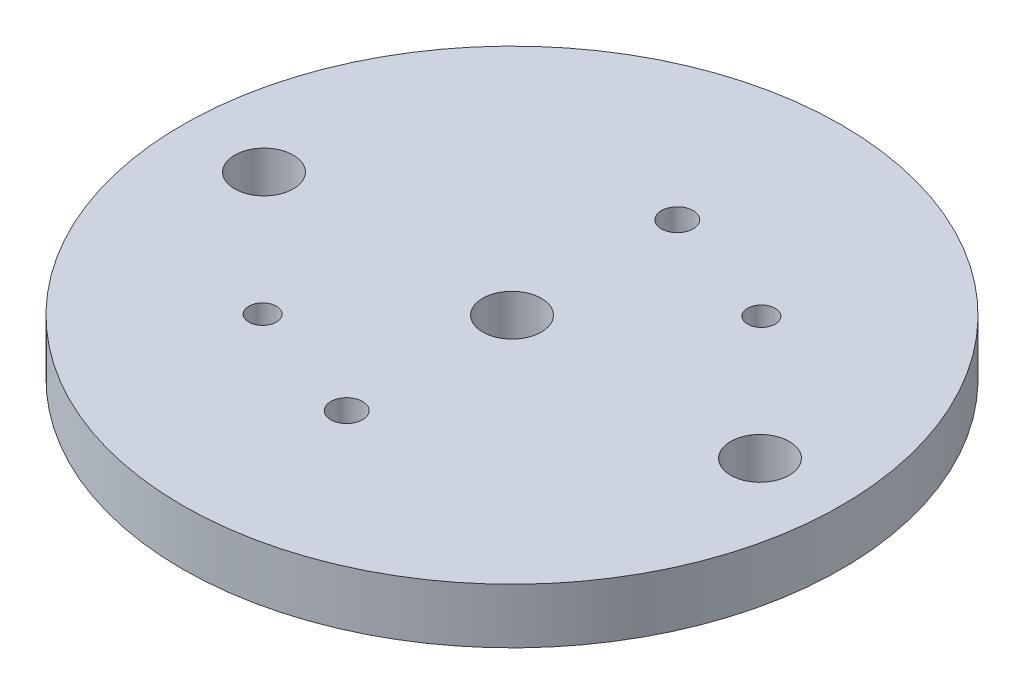
ISO-10303-21;
HEADER;
FILE_DESCRIPTION(('STEP AP214'),'2;1');
FILE_NAME('part.step','',(''),(''),'','','');
FILE_SCHEMA(('AUTOMOTIVE_DESIGN { 1 0 10303 214 1 1 1 1 }'));
ENDSEC;
DATA;
#1=APPLICATION_CONTEXT('core data for automotive mechanical design processes');
#2=APPLICATION_PROTOCOL_DEFINITION('international standard','automotive_design',2000,#1);
#3=PRODUCT_CONTEXT('',#1,'mechanical');
#4=PRODUCT('Part','Part','',(#3));
#5=PRODUCT_RELATED_PRODUCT_CATEGORY('part','',(#4));
#6=PRODUCT_DEFINITION_FORMATION('','',#4);
#7=PRODUCT_DEFINITION_CONTEXT('part definition',#1,'design');
#8=PRODUCT_DEFINITION('design','',#6,#7);
#9=PRODUCT_DEFINITION_SHAPE('','',#8);
#10=(LENGTH_UNIT() NAMED_UNIT(*) SI_UNIT(.MILLI.,.METRE.));
#11=(NAMED_UNIT(*) PLANE_ANGLE_UNIT() SI_UNIT($,.RADIAN.));
#12=(NAMED_UNIT(*) SI_UNIT($,.STERADIAN.) SOLID_ANGLE_UNIT());
#13=UNCERTAINTY_MEASURE_WITH_UNIT(LENGTH_MEASURE(1.E-05),#10,'distance_accuracy_value','');
#14=(GEOMETRIC_REPRESENTATION_CONTEXT(3) GLOBAL_UNCERTAINTY_ASSIGNED_CONTEXT((#13)) GLOBAL_UNIT_ASSIGNED_CONTEXT((#10,
#11,#12)) REPRESENTATION_CONTEXT('',''));
#15=CARTESIAN_POINT('',(0.,0.,0.));
#16=DIRECTION('',(0.,0.,1.));
#17=DIRECTION('',(1.,0.,0.));
#18=AXIS2_PLACEMENT_3D('',#15,#16,#17);
#19=CARTESIAN_POINT('',(0.,3.175,0.));
#20=DIRECTION('',(0.,-1.,0.));
#21=DIRECTION('',(0.,0.,-1.));
#22=AXIS2_PLACEMENT_3D('',#19,#20,#21);
#23=CYLINDRICAL_SURFACE('',#22,37.973);
#24=CARTESIAN_POINT('',(0.,3.175,0.));
#25=DIRECTION('',(0.,1.,0.));
#26=DIRECTION('',(0.,0.,1.));
#27=AXIS2_PLACEMENT_3D('',#24,#25,#26);
#28=CIRCLE('',#27,37.973);
#29=CARTESIAN_POINT('',(0.,3.175,37.973));
#30=VERTEX_POINT('',#29);
#31=EDGE_CURVE('E10',#30,#30,#28,.T.);
#32=ORIENTED_EDGE('',*,*,#31,.F.);
#33=EDGE_LOOP('',(#32));
#34=FACE_BOUND('',#33,.T.);
#35=CARTESIAN_POINT('',(0.,-3.175,0.));
#36=DIRECTION('',(0.,1.,0.));
#37=DIRECTION('',(0.,0.,1.));
#38=AXIS2_PLACEMENT_3D('',#35,#36,#37);
#39=CIRCLE('',#38,37.973);
#40=CARTESIAN_POINT('',(0.,-3.175,37.973));
#41=VERTEX_POINT('',#40);
#42=EDGE_CURVE('E38',#41,#41,#39,.T.);
#43=ORIENTED_EDGE('',*,*,#42,.T.);
#44=EDGE_LOOP('',(#43));
#45=FACE_BOUND('',#44,.T.);
#46=ADVANCED_FACE('F35',(#34,#45),#23,.T.);
#47=CARTESIAN_POINT('',(0.,3.175,0.));
#48=DIRECTION('',(0.,1.,0.));
#49=DIRECTION('',(0.,0.,1.));
#50=AXIS2_PLACEMENT_3D('',#47,#48,#49);
#51=PLANE('',#50);
#52=CARTESIAN_POINT('',(0.,3.175,0.));
#53=DIRECTION('',(0.,1.,0.));
#54=DIRECTION('',(0.,0.,1.));
#55=AXIS2_PLACEMENT_3D('',#52,#53,#54);
#56=CIRCLE('',#55,3.3782);
#57=CARTESIAN_POINT('',(0.,3.175,3.3782));
#58=VERTEX_POINT('',#57);
#59=EDGE_CURVE('E85',#58,#58,#56,.T.);
#60=ORIENTED_EDGE('',*,*,#59,.F.);
#61=EDGE_LOOP('',(#60));
#62=FACE_BOUND('',#61,.T.);
#63=CARTESIAN_POINT('',(14.4697661771786,3.175,-14.2663333333334));
#64=DIRECTION('',(0.,1.,0.));
#65=DIRECTION('',(0.,0.,1.));
#66=AXIS2_PLACEMENT_3D('',#63,#64,#65);
#67=CIRCLE('',#66,1.5875);
#68=CARTESIAN_POINT('',(14.4697661771786,3.175,-12.6788333333334));
#69=VERTEX_POINT('',#68);
#70=EDGE_CURVE('E79',#69,#69,#67,.T.);
#71=ORIENTED_EDGE('',*,*,#70,.F.);
#72=EDGE_LOOP('',(#71));
#73=FACE_BOUND('',#72,.T.);
#74=CARTESIAN_POINT('',(-14.4697661771786,3.175,14.2663333333333));
#75=DIRECTION('',(0.,1.,0.));
#76=DIRECTION('',(0.,0.,1.));
#77=AXIS2_PLACEMENT_3D('',#74,#75,#76);
#78=CIRCLE('',#77,1.5875);
#79=CARTESIAN_POINT('',(-14.4697661771786,3.175,15.8538333333333));
#80=VERTEX_POINT('',#79);
#81=EDGE_CURVE('E73',#80,#80,#78,.T.);
#82=ORIENTED_EDGE('',*,*,#81,.F.);
#83=EDGE_LOOP('',(#82));
#84=FACE_BOUND('',#83,.T.);
#85=CARTESIAN_POINT('',(0.,3.175,-19.05));
#86=DIRECTION('',(0.,1.,0.));
#87=DIRECTION('',(0.,0.,1.));
#88=AXIS2_PLACEMENT_3D('',#85,#86,#87);
#89=CIRCLE('',#88,1.8288);
#90=CARTESIAN_POINT('',(0.,3.175,-17.2212));
#91=VERTEX_POINT('',#90);
#92=EDGE_CURVE('E67',#91,#91,#89,.T.);
#93=ORIENTED_EDGE('',*,*,#92,.F.);
#94=EDGE_LOOP('',(#93));
#95=FACE_BOUND('',#94,.T.);
#96=CARTESIAN_POINT('',(0.,3.175,19.05));
#97=DIRECTION('',(0.,1.,0.));
#98=DIRECTION('',(0.,0.,1.));
#99=AXIS2_PLACEMENT_3D('',#96,#97,#98);
#100=CIRCLE('',#99,1.8288);
#101=CARTESIAN_POINT('',(0.,3.175,20.8788));
#102=VERTEX_POINT('',#101);
#103=EDGE_CURVE('E61',#102,#102,#100,.T.);
#104=ORIENTED_EDGE('',*,*,#103,.F.);
#105=EDGE_LOOP('',(#104));
#106=FACE_BOUND('',#105,.T.);
#107=CARTESIAN_POINT('',(-28.575,3.175,0.));
#108=DIRECTION('',(0.,1.,0.));
#109=DIRECTION('',(0.,0.,1.));
#110=AXIS2_PLACEMENT_3D('',#107,#108,#109);
#111=CIRCLE('',#110,3.37819999999999);
#112=CARTESIAN_POINT('',(-28.575,3.175,3.37819999999999));
#113=VERTEX_POINT('',#112);
#114=EDGE_CURVE('E55',#113,#113,#111,.T.);
#115=ORIENTED_EDGE('',*,*,#114,.F.);
#116=EDGE_LOOP('',(#115));
#117=FACE_BOUND('',#116,.T.);
#118=CARTESIAN_POINT('',(28.575,3.175,0.));
#119=DIRECTION('',(0.,1.,0.));
#120=DIRECTION('',(0.,0.,1.));
#121=AXIS2_PLACEMENT_3D('',#118,#119,#120);
#122=CIRCLE('',#121,3.37819999999999);
#123=CARTESIAN_POINT('',(28.575,3.175,3.37819999999998));
#124=VERTEX_POINT('',#123);
#125=EDGE_CURVE('E49',#124,#124,#122,.T.);
#126=ORIENTED_EDGE('',*,*,#125,.F.);
#127=EDGE_LOOP('',(#126));
#128=FACE_BOUND('',#127,.T.);
#129=ORIENTED_EDGE('',*,*,#31,.T.);
#130=EDGE_LOOP('',(#129));
#131=FACE_BOUND('',#130,.T.);
#132=ADVANCED_FACE('F91',(#62,#73,#84,#95,#106,#117,#128,#131),#51,.T.);
#133=CARTESIAN_POINT('',(0.,-3.175,0.));
#134=DIRECTION('',(0.,1.,0.));
#135=DIRECTION('',(0.,0.,1.));
#136=AXIS2_PLACEMENT_3D('',#133,#134,#135);
#137=PLANE('',#136);
#138=CARTESIAN_POINT('',(0.,-3.175,0.));
#139=DIRECTION('',(0.,1.,0.));
#140=DIRECTION('',(0.,0.,1.));
#141=AXIS2_PLACEMENT_3D('',#138,#139,#140);
#142=CIRCLE('',#141,3.3782);
#143=CARTESIAN_POINT('',(0.,-3.175,3.3782));
#144=VERTEX_POINT('',#143);
#145=EDGE_CURVE('E82',#144,#144,#142,.T.);
#146=ORIENTED_EDGE('',*,*,#145,.T.);
#147=EDGE_LOOP('',(#146));
#148=FACE_BOUND('',#147,.T.);
#149=CARTESIAN_POINT('',(14.4697661771786,-3.175,-14.2663333333334));
#150=DIRECTION('',(0.,1.,0.));
#151=DIRECTION('',(0.,0.,1.));
#152=AXIS2_PLACEMENT_3D('',#149,#150,#151);
#153=CIRCLE('',#152,1.5875);
#154=CARTESIAN_POINT('',(14.4697661771786,-3.175,-12.6788333333334));
#155=VERTEX_POINT('',#154);
#156=EDGE_CURVE('E76',#155,#155,#153,.T.);
#157=ORIENTED_EDGE('',*,*,#156,.T.);
#158=EDGE_LOOP('',(#157));
#159=FACE_BOUND('',#158,.T.);
#160=CARTESIAN_POINT('',(-14.4697661771786,-3.175,14.2663333333333));
#161=DIRECTION('',(0.,1.,0.));
#162=DIRECTION('',(0.,0.,1.));
#163=AXIS2_PLACEMENT_3D('',#160,#161,#162);
#164=CIRCLE('',#163,1.5875);
#165=CARTESIAN_POINT('',(-14.4697661771786,-3.175,15.8538333333333));
#166=VERTEX_POINT('',#165);
#167=EDGE_CURVE('E70',#166,#166,#164,.T.);
#168=ORIENTED_EDGE('',*,*,#167,.T.);
#169=EDGE_LOOP('',(#168));
#170=FACE_BOUND('',#169,.T.);
#171=CARTESIAN_POINT('',(0.,-3.175,-19.05));
#172=DIRECTION('',(0.,1.,0.));
#173=DIRECTION('',(0.,0.,1.));
#174=AXIS2_PLACEMENT_3D('',#171,#172,#173);
#175=CIRCLE('',#174,1.8288);
#176=CARTESIAN_POINT('',(0.,-3.175,-17.2212));
#177=VERTEX_POINT('',#176);
#178=EDGE_CURVE('E64',#177,#177,#175,.T.);
#179=ORIENTED_EDGE('',*,*,#178,.T.);
#180=EDGE_LOOP('',(#179));
#181=FACE_BOUND('',#180,.T.);
#182=CARTESIAN_POINT('',(0.,-3.175,19.05));
#183=DIRECTION('',(0.,1.,0.));
#184=DIRECTION('',(0.,0.,1.));
#185=AXIS2_PLACEMENT_3D('',#182,#183,#184);
#186=CIRCLE('',#185,1.8288);
#187=CARTESIAN_POINT('',(0.,-3.175,20.8788));
#188=VERTEX_POINT('',#187);
#189=EDGE_CURVE('E58',#188,#188,#186,.T.);
#190=ORIENTED_EDGE('',*,*,#189,.T.);
#191=EDGE_LOOP('',(#190));
#192=FACE_BOUND('',#191,.T.);
#193=CARTESIAN_POINT('',(-28.575,-3.175,0.));
#194=DIRECTION('',(0.,1.,0.));
#195=DIRECTION('',(0.,0.,1.));
#196=AXIS2_PLACEMENT_3D('',#193,#194,#195);
#197=CIRCLE('',#196,3.3782);
#198=CARTESIAN_POINT('',(-28.575,-3.175,3.3782));
#199=VERTEX_POINT('',#198);
#200=EDGE_CURVE('E52',#199,#199,#197,.T.);
#201=ORIENTED_EDGE('',*,*,#200,.T.);
#202=EDGE_LOOP('',(#201));
#203=FACE_BOUND('',#202,.T.);
#204=CARTESIAN_POINT('',(28.575,-3.175,0.));
#205=DIRECTION('',(0.,1.,0.));
#206=DIRECTION('',(0.,0.,1.));
#207=AXIS2_PLACEMENT_3D('',#204,#205,#206);
#208=CIRCLE('',#207,3.3782);
#209=CARTESIAN_POINT('',(28.575,-3.175,3.37819999999999));
#210=VERTEX_POINT('',#209);
#211=EDGE_CURVE('E45',#210,#210,#208,.T.);
#212=ORIENTED_EDGE('',*,*,#211,.T.);
#213=EDGE_LOOP('',(#212));
#214=FACE_BOUND('',#213,.T.);
#215=ORIENTED_EDGE('',*,*,#42,.F.);
#216=EDGE_LOOP('',(#215));
#217=FACE_BOUND('',#216,.T.);
#218=ADVANCED_FACE('F94',(#148,#159,#170,#181,#192,#203,#214,#217),#137,.F.);
#219=CARTESIAN_POINT('',(28.575,3.175,0.));
#220=DIRECTION('',(0.,1.,0.));
#221=DIRECTION('',(0.,0.,1.));
#222=AXIS2_PLACEMENT_3D('',#219,#220,#221);
#223=CYLINDRICAL_SURFACE('',#222,3.37819999999999);
#224=ORIENTED_EDGE('',*,*,#211,.F.);
#225=EDGE_LOOP('',(#224));
#226=FACE_BOUND('',#225,.T.);
#227=ORIENTED_EDGE('',*,*,#125,.T.);
#228=EDGE_LOOP('',(#227));
#229=FACE_BOUND('',#228,.T.);
#230=ADVANCED_FACE('F108',(#226,#229),#223,.F.);
#231=CARTESIAN_POINT('',(-28.575,3.175,0.));
#232=DIRECTION('',(0.,1.,0.));
#233=DIRECTION('',(0.,0.,1.));
#234=AXIS2_PLACEMENT_3D('',#231,#232,#233);
#235=CYLINDRICAL_SURFACE('',#234,3.37819999999999);
#236=ORIENTED_EDGE('',*,*,#200,.F.);
#237=EDGE_LOOP('',(#236));
#238=FACE_BOUND('',#237,.T.);
#239=ORIENTED_EDGE('',*,*,#114,.T.);
#240=EDGE_LOOP('',(#239));
#241=FACE_BOUND('',#240,.T.);
#242=ADVANCED_FACE('F110',(#238,#241),#235,.F.);
#243=CARTESIAN_POINT('',(0.,3.175,19.05));
#244=DIRECTION('',(0.,1.,0.));
#245=DIRECTION('',(0.,0.,1.));
#246=AXIS2_PLACEMENT_3D('',#243,#244,#245);
#247=CYLINDRICAL_SURFACE('',#246,1.8288);
#248=ORIENTED_EDGE('',*,*,#189,.F.);
#249=EDGE_LOOP('',(#248));
#250=FACE_BOUND('',#249,.T.);
#251=ORIENTED_EDGE('',*,*,#103,.T.);
#252=EDGE_LOOP('',(#251));
#253=FACE_BOUND('',#252,.T.);
#254=ADVANCED_FACE('F117',(#250,#253),#247,.F.);
#255=CARTESIAN_POINT('',(0.,3.175,-19.05));
#256=DIRECTION('',(0.,1.,0.));
#257=DIRECTION('',(0.,0.,1.));
#258=AXIS2_PLACEMENT_3D('',#255,#256,#257);
#259=CYLINDRICAL_SURFACE('',#258,1.8288);
#260=ORIENTED_EDGE('',*,*,#178,.F.);
#261=EDGE_LOOP('',(#260));
#262=FACE_BOUND('',#261,.T.);
#263=ORIENTED_EDGE('',*,*,#92,.T.);
#264=EDGE_LOOP('',(#263));
#265=FACE_BOUND('',#264,.T.);
#266=ADVANCED_FACE('F164',(#262,#265),#259,.F.);
#267=CARTESIAN_POINT('',(-14.4697661771786,3.175,14.2663333333333));
#268=DIRECTION('',(0.,1.,0.));
#269=DIRECTION('',(0.,0.,1.));
#270=AXIS2_PLACEMENT_3D('',#267,#268,#269);
#271=CYLINDRICAL_SURFACE('',#270,1.5875);
#272=ORIENTED_EDGE('',*,*,#167,.F.);
#273=EDGE_LOOP('',(#272));
#274=FACE_BOUND('',#273,.T.);
#275=ORIENTED_EDGE('',*,*,#81,.T.);
#276=EDGE_LOOP('',(#275));
#277=FACE_BOUND('',#276,.T.);
#278=ADVANCED_FACE('F157',(#274,#277),#271,.F.);
#279=CARTESIAN_POINT('',(14.4697661771786,3.175,-14.2663333333334));
#280=DIRECTION('',(0.,1.,0.));
#281=DIRECTION('',(0.,0.,1.));
#282=AXIS2_PLACEMENT_3D('',#279,#280,#281);
#283=CYLINDRICAL_SURFACE('',#282,1.5875);
#284=ORIENTED_EDGE('',*,*,#156,.F.);
#285=EDGE_LOOP('',(#284));
#286=FACE_BOUND('',#285,.T.);
#287=ORIENTED_EDGE('',*,*,#70,.T.);
#288=EDGE_LOOP('',(#287));
#289=FACE_BOUND('',#288,.T.);
#290=ADVANCED_FACE('F147',(#286,#289),#283,.F.);
#291=CARTESIAN_POINT('',(0.,3.175,0.));
#292=DIRECTION('',(0.,1.,0.));
#293=DIRECTION('',(0.,0.,1.));
#294=AXIS2_PLACEMENT_3D('',#291,#292,#293);
#295=CYLINDRICAL_SURFACE('',#294,3.3782);
#296=ORIENTED_EDGE('',*,*,#145,.F.);
#297=EDGE_LOOP('',(#296));
#298=FACE_BOUND('',#297,.T.);
#299=ORIENTED_EDGE('',*,*,#59,.T.);
#300=EDGE_LOOP('',(#299));
#301=FACE_BOUND('',#300,.T.);
#302=ADVANCED_FACE('F89',(#298,#301),#295,.F.);
#303=CLOSED_SHELL('',(#46,#132,#218,#230,#242,#254,#266,#278,#290,#302));
#304=MANIFOLD_SOLID_BREP('B2',#303);
#305=ADVANCED_BREP_SHAPE_REPRESENTATION('',(#18,#304),#14);
#306=SHAPE_DEFINITION_REPRESENTATION(#9,#305);
ENDSEC;
END-ISO-10303-21;
